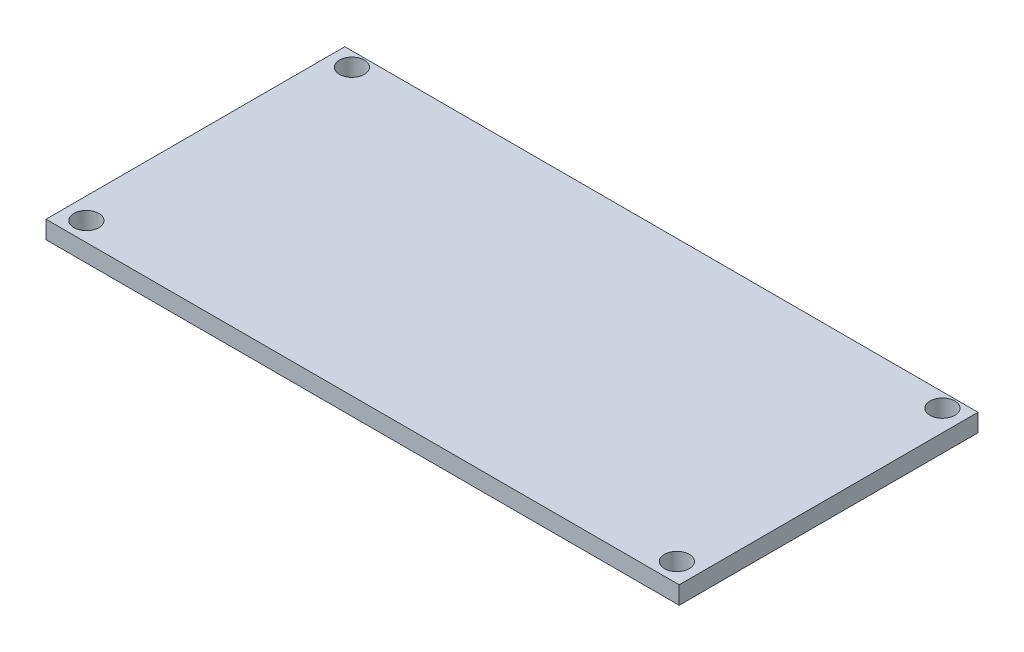
ISO-10303-21;
HEADER;
FILE_DESCRIPTION(('STEP AP214'),'2;1');
FILE_NAME('part.step','',(''),(''),'','','');
FILE_SCHEMA(('AUTOMOTIVE_DESIGN { 1 0 10303 214 1 1 1 1 }'));
ENDSEC;
DATA;
#1=APPLICATION_CONTEXT('core data for automotive mechanical design processes');
#2=APPLICATION_PROTOCOL_DEFINITION('international standard','automotive_design',2000,#1);
#3=PRODUCT_CONTEXT('',#1,'mechanical');
#4=PRODUCT('Part','Part','',(#3));
#5=PRODUCT_RELATED_PRODUCT_CATEGORY('part','',(#4));
#6=PRODUCT_DEFINITION_FORMATION('','',#4);
#7=PRODUCT_DEFINITION_CONTEXT('part definition',#1,'design');
#8=PRODUCT_DEFINITION('design','',#6,#7);
#9=PRODUCT_DEFINITION_SHAPE('','',#8);
#10=(LENGTH_UNIT() NAMED_UNIT(*) SI_UNIT(.MILLI.,.METRE.));
#11=(NAMED_UNIT(*) PLANE_ANGLE_UNIT() SI_UNIT($,.RADIAN.));
#12=(NAMED_UNIT(*) SI_UNIT($,.STERADIAN.) SOLID_ANGLE_UNIT());
#13=UNCERTAINTY_MEASURE_WITH_UNIT(LENGTH_MEASURE(1.E-05),#10,'distance_accuracy_value','');
#14=(GEOMETRIC_REPRESENTATION_CONTEXT(3) GLOBAL_UNCERTAINTY_ASSIGNED_CONTEXT((#13)) GLOBAL_UNIT_ASSIGNED_CONTEXT((#10,
#11,#12)) REPRESENTATION_CONTEXT('',''));
#15=CARTESIAN_POINT('',(0.,0.,0.));
#16=DIRECTION('',(0.,0.,1.));
#17=DIRECTION('',(1.,0.,0.));
#18=AXIS2_PLACEMENT_3D('',#15,#16,#17);
#19=CARTESIAN_POINT('',(0.,2.5,-42.));
#20=DIRECTION('',(1.,0.,0.));
#21=DIRECTION('',(0.,0.,-1.));
#22=AXIS2_PLACEMENT_3D('',#19,#20,#21);
#23=PLANE('',#22);
#24=DIRECTION('',(0.,0.,1.));
#25=VECTOR('',#24,1.);
#26=CARTESIAN_POINT('',(0.,0.,-42.));
#27=LINE('',#26,#25);
#28=CARTESIAN_POINT('',(0.,0.,-42.));
#29=VERTEX_POINT('',#28);
#30=CARTESIAN_POINT('',(0.,0.,0.));
#31=VERTEX_POINT('',#30);
#32=EDGE_CURVE('E103',#29,#31,#27,.T.);
#33=ORIENTED_EDGE('',*,*,#32,.T.);
#34=DIRECTION('',(0.,-1.,0.));
#35=VECTOR('',#34,1.);
#36=CARTESIAN_POINT('',(0.,2.5,0.));
#37=LINE('',#36,#35);
#38=CARTESIAN_POINT('',(0.,2.5,0.));
#39=VERTEX_POINT('',#38);
#40=EDGE_CURVE('E11',#39,#31,#37,.T.);
#41=ORIENTED_EDGE('',*,*,#40,.F.);
#42=DIRECTION('',(0.,0.,1.));
#43=VECTOR('',#42,1.);
#44=CARTESIAN_POINT('',(0.,2.5,-42.));
#45=LINE('',#44,#43);
#46=CARTESIAN_POINT('',(0.,2.5,-42.));
#47=VERTEX_POINT('',#46);
#48=EDGE_CURVE('E91',#47,#39,#45,.T.);
#49=ORIENTED_EDGE('',*,*,#48,.F.);
#50=DIRECTION('',(0.,-1.,0.));
#51=VECTOR('',#50,1.);
#52=CARTESIAN_POINT('',(0.,2.5,-42.));
#53=LINE('',#52,#51);
#54=EDGE_CURVE('E99',#47,#29,#53,.T.);
#55=ORIENTED_EDGE('',*,*,#54,.T.);
#56=EDGE_LOOP('',(#33,#41,#49,#55));
#57=FACE_BOUND('',#56,.T.);
#58=ADVANCED_FACE('F40',(#57),#23,.F.);
#59=CARTESIAN_POINT('',(0.,2.5,0.));
#60=DIRECTION('',(0.,0.,-1.));
#61=DIRECTION('',(-1.,0.,0.));
#62=AXIS2_PLACEMENT_3D('',#59,#60,#61);
#63=PLANE('',#62);
#64=DIRECTION('',(1.,0.,0.));
#65=VECTOR('',#64,1.);
#66=CARTESIAN_POINT('',(0.,0.,0.));
#67=LINE('',#66,#65);
#68=CARTESIAN_POINT('',(89.,0.,0.));
#69=VERTEX_POINT('',#68);
#70=EDGE_CURVE('E95',#31,#69,#67,.T.);
#71=ORIENTED_EDGE('',*,*,#70,.T.);
#72=DIRECTION('',(0.,-1.,0.));
#73=VECTOR('',#72,1.);
#74=CARTESIAN_POINT('',(89.,2.5,0.));
#75=LINE('',#74,#73);
#76=CARTESIAN_POINT('',(89.,2.5,0.));
#77=VERTEX_POINT('',#76);
#78=EDGE_CURVE('E48',#77,#69,#75,.T.);
#79=ORIENTED_EDGE('',*,*,#78,.F.);
#80=DIRECTION('',(1.,0.,0.));
#81=VECTOR('',#80,1.);
#82=CARTESIAN_POINT('',(0.,2.5,0.));
#83=LINE('',#82,#81);
#84=EDGE_CURVE('E86',#39,#77,#83,.T.);
#85=ORIENTED_EDGE('',*,*,#84,.F.);
#86=ORIENTED_EDGE('',*,*,#40,.T.);
#87=EDGE_LOOP('',(#71,#79,#85,#86));
#88=FACE_BOUND('',#87,.T.);
#89=ADVANCED_FACE('F94',(#88),#63,.F.);
#90=CARTESIAN_POINT('',(89.,2.5,-42.));
#91=DIRECTION('',(-1.,0.,0.));
#92=DIRECTION('',(0.,0.,1.));
#93=AXIS2_PLACEMENT_3D('',#90,#91,#92);
#94=PLANE('',#93);
#95=DIRECTION('',(0.,0.,-1.));
#96=VECTOR('',#95,1.);
#97=CARTESIAN_POINT('',(89.,0.,-42.));
#98=LINE('',#97,#96);
#99=CARTESIAN_POINT('',(89.,0.,-42.));
#100=VERTEX_POINT('',#99);
#101=EDGE_CURVE('E73',#69,#100,#98,.T.);
#102=ORIENTED_EDGE('',*,*,#101,.T.);
#103=DIRECTION('',(0.,-1.,0.));
#104=VECTOR('',#103,1.);
#105=CARTESIAN_POINT('',(89.,2.5,-42.));
#106=LINE('',#105,#104);
#107=CARTESIAN_POINT('',(89.,2.5,-42.));
#108=VERTEX_POINT('',#107);
#109=EDGE_CURVE('E96',#108,#100,#106,.T.);
#110=ORIENTED_EDGE('',*,*,#109,.F.);
#111=DIRECTION('',(0.,0.,-1.));
#112=VECTOR('',#111,1.);
#113=CARTESIAN_POINT('',(89.,2.5,-42.));
#114=LINE('',#113,#112);
#115=EDGE_CURVE('E89',#77,#108,#114,.T.);
#116=ORIENTED_EDGE('',*,*,#115,.F.);
#117=ORIENTED_EDGE('',*,*,#78,.T.);
#118=EDGE_LOOP('',(#102,#110,#116,#117));
#119=FACE_BOUND('',#118,.T.);
#120=ADVANCED_FACE('F97',(#119),#94,.F.);
#121=CARTESIAN_POINT('',(0.,2.5,-42.));
#122=DIRECTION('',(0.,0.,1.));
#123=DIRECTION('',(1.,0.,0.));
#124=AXIS2_PLACEMENT_3D('',#121,#122,#123);
#125=PLANE('',#124);
#126=DIRECTION('',(-1.,0.,0.));
#127=VECTOR('',#126,1.);
#128=CARTESIAN_POINT('',(0.,0.,-42.));
#129=LINE('',#128,#127);
#130=EDGE_CURVE('E79',#100,#29,#129,.T.);
#131=ORIENTED_EDGE('',*,*,#130,.T.);
#132=ORIENTED_EDGE('',*,*,#54,.F.);
#133=DIRECTION('',(-1.,0.,0.));
#134=VECTOR('',#133,1.);
#135=CARTESIAN_POINT('',(0.,2.5,-42.));
#136=LINE('',#135,#134);
#137=EDGE_CURVE('E56',#108,#47,#136,.T.);
#138=ORIENTED_EDGE('',*,*,#137,.F.);
#139=ORIENTED_EDGE('',*,*,#109,.T.);
#140=EDGE_LOOP('',(#131,#132,#138,#139));
#141=FACE_BOUND('',#140,.T.);
#142=ADVANCED_FACE('F111',(#141),#125,.F.);
#143=CARTESIAN_POINT('',(0.,2.5,0.));
#144=DIRECTION('',(0.,1.,0.));
#145=DIRECTION('',(0.,0.,1.));
#146=AXIS2_PLACEMENT_3D('',#143,#144,#145);
#147=PLANE('',#146);
#148=CARTESIAN_POINT('',(2.99999999999999,2.5,-2.67459782040538));
#149=DIRECTION('',(0.,1.,0.));
#150=DIRECTION('',(0.,0.,-1.));
#151=AXIS2_PLACEMENT_3D('',#148,#149,#150);
#152=CIRCLE('',#151,1.75);
#153=CARTESIAN_POINT('',(2.99999999999999,2.5,-4.42459782040539));
#154=VERTEX_POINT('',#153);
#155=EDGE_CURVE('E126',#154,#154,#152,.T.);
#156=ORIENTED_EDGE('',*,*,#155,.F.);
#157=EDGE_LOOP('',(#156));
#158=FACE_BOUND('',#157,.T.);
#159=CARTESIAN_POINT('',(86.,2.5,-2.67459782040538));
#160=DIRECTION('',(0.,1.,0.));
#161=DIRECTION('',(0.,0.,1.));
#162=AXIS2_PLACEMENT_3D('',#159,#160,#161);
#163=CIRCLE('',#162,1.75);
#164=CARTESIAN_POINT('',(86.,2.5,-0.924597820405387));
#165=VERTEX_POINT('',#164);
#166=EDGE_CURVE('E132',#165,#165,#163,.T.);
#167=ORIENTED_EDGE('',*,*,#166,.F.);
#168=EDGE_LOOP('',(#167));
#169=FACE_BOUND('',#168,.T.);
#170=CARTESIAN_POINT('',(86.,2.5,-40.));
#171=DIRECTION('',(0.,1.,0.));
#172=DIRECTION('',(0.,0.,-1.));
#173=AXIS2_PLACEMENT_3D('',#170,#171,#172);
#174=CIRCLE('',#173,1.75);
#175=CARTESIAN_POINT('',(86.,2.5,-41.75));
#176=VERTEX_POINT('',#175);
#177=EDGE_CURVE('E120',#176,#176,#174,.T.);
#178=ORIENTED_EDGE('',*,*,#177,.F.);
#179=EDGE_LOOP('',(#178));
#180=FACE_BOUND('',#179,.T.);
#181=CARTESIAN_POINT('',(2.99999999999999,2.5,-40.));
#182=DIRECTION('',(0.,1.,0.));
#183=DIRECTION('',(0.,0.,1.));
#184=AXIS2_PLACEMENT_3D('',#181,#182,#183);
#185=CIRCLE('',#184,1.75);
#186=CARTESIAN_POINT('',(2.99999999999999,2.5,-38.25));
#187=VERTEX_POINT('',#186);
#188=EDGE_CURVE('E117',#187,#187,#185,.T.);
#189=ORIENTED_EDGE('',*,*,#188,.F.);
#190=EDGE_LOOP('',(#189));
#191=FACE_BOUND('',#190,.T.);
#192=ORIENTED_EDGE('',*,*,#48,.T.);
#193=ORIENTED_EDGE('',*,*,#84,.T.);
#194=ORIENTED_EDGE('',*,*,#115,.T.);
#195=ORIENTED_EDGE('',*,*,#137,.T.);
#196=EDGE_LOOP('',(#192,#193,#194,#195));
#197=FACE_BOUND('',#196,.T.);
#198=ADVANCED_FACE('F87',(#158,#169,#180,#191,#197),#147,.T.);
#199=CARTESIAN_POINT('',(0.,0.,0.));
#200=DIRECTION('',(0.,1.,0.));
#201=DIRECTION('',(0.,0.,1.));
#202=AXIS2_PLACEMENT_3D('',#199,#200,#201);
#203=PLANE('',#202);
#204=CARTESIAN_POINT('',(2.99999999999999,0.,-2.67459782040538));
#205=DIRECTION('',(0.,1.,0.));
#206=DIRECTION('',(0.,0.,-1.));
#207=AXIS2_PLACEMENT_3D('',#204,#205,#206);
#208=CIRCLE('',#207,1.75);
#209=CARTESIAN_POINT('',(2.99999999999999,0.,-4.42459782040539));
#210=VERTEX_POINT('',#209);
#211=EDGE_CURVE('E123',#210,#210,#208,.T.);
#212=ORIENTED_EDGE('',*,*,#211,.T.);
#213=EDGE_LOOP('',(#212));
#214=FACE_BOUND('',#213,.T.);
#215=CARTESIAN_POINT('',(86.,0.,-2.67459782040538));
#216=DIRECTION('',(0.,1.,0.));
#217=DIRECTION('',(0.,0.,1.));
#218=AXIS2_PLACEMENT_3D('',#215,#216,#217);
#219=CIRCLE('',#218,1.75);
#220=CARTESIAN_POINT('',(86.,0.,-0.924597820405387));
#221=VERTEX_POINT('',#220);
#222=EDGE_CURVE('E129',#221,#221,#219,.T.);
#223=ORIENTED_EDGE('',*,*,#222,.T.);
#224=EDGE_LOOP('',(#223));
#225=FACE_BOUND('',#224,.T.);
#226=CARTESIAN_POINT('',(86.,0.,-40.));
#227=DIRECTION('',(0.,1.,0.));
#228=DIRECTION('',(0.,0.,-1.));
#229=AXIS2_PLACEMENT_3D('',#226,#227,#228);
#230=CIRCLE('',#229,1.75);
#231=CARTESIAN_POINT('',(86.,0.,-41.75));
#232=VERTEX_POINT('',#231);
#233=EDGE_CURVE('E135',#232,#232,#230,.T.);
#234=ORIENTED_EDGE('',*,*,#233,.T.);
#235=EDGE_LOOP('',(#234));
#236=FACE_BOUND('',#235,.T.);
#237=CARTESIAN_POINT('',(2.99999999999999,0.,-40.));
#238=DIRECTION('',(0.,1.,0.));
#239=DIRECTION('',(0.,0.,1.));
#240=AXIS2_PLACEMENT_3D('',#237,#238,#239);
#241=CIRCLE('',#240,1.75);
#242=CARTESIAN_POINT('',(2.99999999999999,0.,-38.25));
#243=VERTEX_POINT('',#242);
#244=EDGE_CURVE('E106',#243,#243,#241,.T.);
#245=ORIENTED_EDGE('',*,*,#244,.T.);
#246=EDGE_LOOP('',(#245));
#247=FACE_BOUND('',#246,.T.);
#248=ORIENTED_EDGE('',*,*,#32,.F.);
#249=ORIENTED_EDGE('',*,*,#130,.F.);
#250=ORIENTED_EDGE('',*,*,#101,.F.);
#251=ORIENTED_EDGE('',*,*,#70,.F.);
#252=EDGE_LOOP('',(#248,#249,#250,#251));
#253=FACE_BOUND('',#252,.T.);
#254=ADVANCED_FACE('F114',(#214,#225,#236,#247,#253),#203,.F.);
#255=CARTESIAN_POINT('',(2.99999999999999,0.,-40.));
#256=DIRECTION('',(0.,1.,0.));
#257=DIRECTION('',(0.,0.,1.));
#258=AXIS2_PLACEMENT_3D('',#255,#256,#257);
#259=CYLINDRICAL_SURFACE('',#258,1.75);
#260=ORIENTED_EDGE('',*,*,#244,.F.);
#261=EDGE_LOOP('',(#260));
#262=FACE_BOUND('',#261,.T.);
#263=ORIENTED_EDGE('',*,*,#188,.T.);
#264=EDGE_LOOP('',(#263));
#265=FACE_BOUND('',#264,.T.);
#266=ADVANCED_FACE('F149',(#262,#265),#259,.F.);
#267=CARTESIAN_POINT('',(86.,0.,-40.));
#268=DIRECTION('',(0.,1.,0.));
#269=DIRECTION('',(0.,0.,1.));
#270=AXIS2_PLACEMENT_3D('',#267,#268,#269);
#271=CYLINDRICAL_SURFACE('',#270,1.75);
#272=ORIENTED_EDGE('',*,*,#233,.F.);
#273=EDGE_LOOP('',(#272));
#274=FACE_BOUND('',#273,.T.);
#275=ORIENTED_EDGE('',*,*,#177,.T.);
#276=EDGE_LOOP('',(#275));
#277=FACE_BOUND('',#276,.T.);
#278=ADVANCED_FACE('F141',(#274,#277),#271,.F.);
#279=CARTESIAN_POINT('',(86.,0.,-2.67459782040538));
#280=DIRECTION('',(0.,1.,0.));
#281=DIRECTION('',(0.,0.,1.));
#282=AXIS2_PLACEMENT_3D('',#279,#280,#281);
#283=CYLINDRICAL_SURFACE('',#282,1.75);
#284=ORIENTED_EDGE('',*,*,#222,.F.);
#285=EDGE_LOOP('',(#284));
#286=FACE_BOUND('',#285,.T.);
#287=ORIENTED_EDGE('',*,*,#166,.T.);
#288=EDGE_LOOP('',(#287));
#289=FACE_BOUND('',#288,.T.);
#290=ADVANCED_FACE('F157',(#286,#289),#283,.F.);
#291=CARTESIAN_POINT('',(2.99999999999999,0.,-2.67459782040538));
#292=DIRECTION('',(0.,1.,0.));
#293=DIRECTION('',(0.,0.,1.));
#294=AXIS2_PLACEMENT_3D('',#291,#292,#293);
#295=CYLINDRICAL_SURFACE('',#294,1.75);
#296=ORIENTED_EDGE('',*,*,#211,.F.);
#297=EDGE_LOOP('',(#296));
#298=FACE_BOUND('',#297,.T.);
#299=ORIENTED_EDGE('',*,*,#155,.T.);
#300=EDGE_LOOP('',(#299));
#301=FACE_BOUND('',#300,.T.);
#302=ADVANCED_FACE('F208',(#298,#301),#295,.F.);
#303=CLOSED_SHELL('',(#58,#89,#120,#142,#198,#254,#266,#278,#290,#302));
#304=MANIFOLD_SOLID_BREP('B2',#303);
#305=ADVANCED_BREP_SHAPE_REPRESENTATION('',(#18,#304),#14);
#306=SHAPE_DEFINITION_REPRESENTATION(#9,#305);
ENDSEC;
END-ISO-10303-21;
